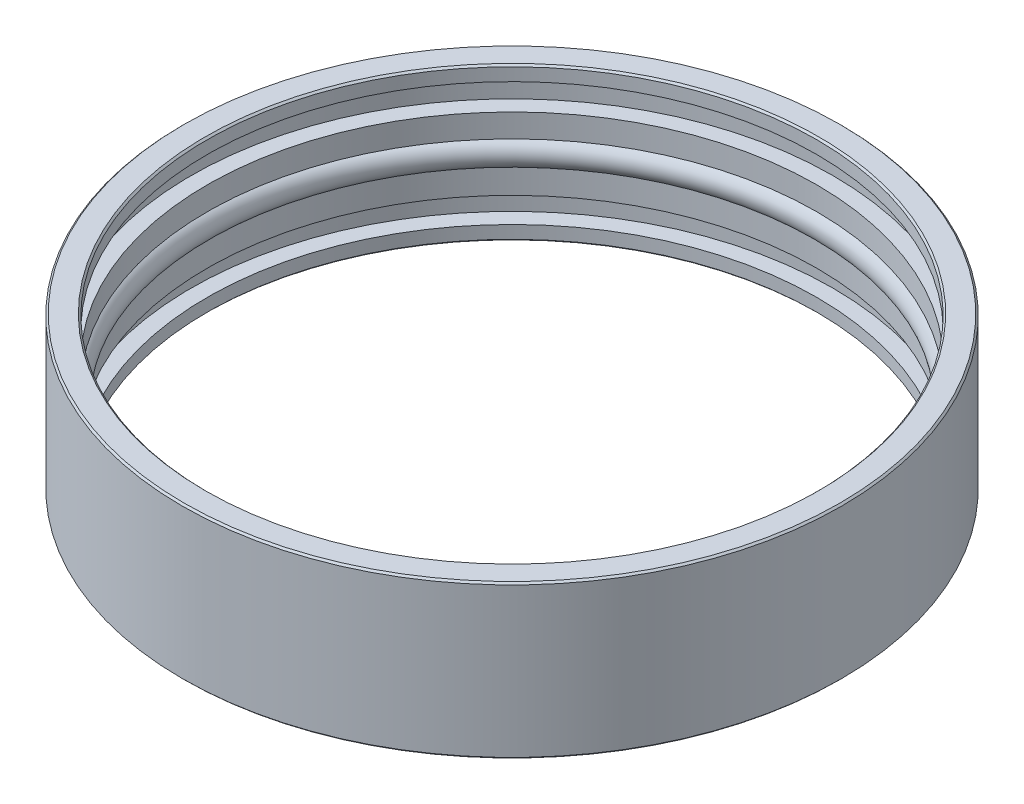
ISO-10303-21;
HEADER;
FILE_DESCRIPTION(('STEP AP214'),'2;1');
FILE_NAME('part.step','',(''),(''),'','','');
FILE_SCHEMA(('AUTOMOTIVE_DESIGN { 1 0 10303 214 1 1 1 1 }'));
ENDSEC;
DATA;
#1=APPLICATION_CONTEXT('core data for automotive mechanical design processes');
#2=APPLICATION_PROTOCOL_DEFINITION('international standard','automotive_design',2000,#1);
#3=PRODUCT_CONTEXT('',#1,'mechanical');
#4=PRODUCT('Part','Part','',(#3));
#5=PRODUCT_RELATED_PRODUCT_CATEGORY('part','',(#4));
#6=PRODUCT_DEFINITION_FORMATION('','',#4);
#7=PRODUCT_DEFINITION_CONTEXT('part definition',#1,'design');
#8=PRODUCT_DEFINITION('design','',#6,#7);
#9=PRODUCT_DEFINITION_SHAPE('','',#8);
#10=(LENGTH_UNIT() NAMED_UNIT(*) SI_UNIT(.MILLI.,.METRE.));
#11=(NAMED_UNIT(*) PLANE_ANGLE_UNIT() SI_UNIT($,.RADIAN.));
#12=(NAMED_UNIT(*) SI_UNIT($,.STERADIAN.) SOLID_ANGLE_UNIT());
#13=UNCERTAINTY_MEASURE_WITH_UNIT(LENGTH_MEASURE(1.E-05),#10,'distance_accuracy_value','');
#14=(GEOMETRIC_REPRESENTATION_CONTEXT(3) GLOBAL_UNCERTAINTY_ASSIGNED_CONTEXT((#13)) GLOBAL_UNIT_ASSIGNED_CONTEXT((#10,
#11,#12)) REPRESENTATION_CONTEXT('',''));
#15=CARTESIAN_POINT('',(0.,0.,0.));
#16=DIRECTION('',(0.,0.,1.));
#17=DIRECTION('',(1.,0.,0.));
#18=AXIS2_PLACEMENT_3D('',#15,#16,#17);
#19=CARTESIAN_POINT('',(0.,-46.1843158015476,0.));
#20=DIRECTION('',(0.,-1.,0.));
#21=DIRECTION('',(0.,0.,-1.));
#22=AXIS2_PLACEMENT_3D('',#19,#20,#21);
#23=CYLINDRICAL_SURFACE('',#22,52.25);
#24=CARTESIAN_POINT('',(0.,6.40345988806243,0.));
#25=DIRECTION('',(0.,1.,0.));
#26=DIRECTION('',(0.,0.,1.));
#27=AXIS2_PLACEMENT_3D('',#24,#25,#26);
#28=CIRCLE('',#27,52.25);
#29=CARTESIAN_POINT('',(0.,6.40345988806243,52.25));
#30=VERTEX_POINT('',#29);
#31=EDGE_CURVE('E42',#30,#30,#28,.T.);
#32=ORIENTED_EDGE('',*,*,#31,.T.);
#33=EDGE_LOOP('',(#32));
#34=FACE_BOUND('',#33,.T.);
#35=CARTESIAN_POINT('',(0.,4.20345988806245,0.));
#36=DIRECTION('',(0.,-1.,0.));
#37=DIRECTION('',(0.,0.,-1.));
#38=AXIS2_PLACEMENT_3D('',#35,#36,#37);
#39=CIRCLE('',#38,52.25);
#40=CARTESIAN_POINT('',(0.,4.20345988806245,-52.25));
#41=VERTEX_POINT('',#40);
#42=EDGE_CURVE('E90',#41,#41,#39,.T.);
#43=ORIENTED_EDGE('',*,*,#42,.T.);
#44=EDGE_LOOP('',(#43));
#45=FACE_BOUND('',#44,.T.);
#46=ADVANCED_FACE('F31',(#34,#45),#23,.F.);
#47=CARTESIAN_POINT('',(52.25,6.70345988806245,0.));
#48=DIRECTION('',(0.,1.,0.));
#49=DIRECTION('',(0.,0.,1.));
#50=AXIS2_PLACEMENT_3D('',#47,#48,#49);
#51=PLANE('',#50);
#52=CARTESIAN_POINT('',(0.,6.70345988806245,0.));
#53=DIRECTION('',(0.,1.,0.));
#54=DIRECTION('',(0.,0.,1.));
#55=AXIS2_PLACEMENT_3D('',#52,#53,#54);
#56=CIRCLE('',#55,52.55);
#57=CARTESIAN_POINT('',(0.,6.70345988806245,52.55));
#58=VERTEX_POINT('',#57);
#59=EDGE_CURVE('E46',#58,#58,#56,.F.);
#60=ORIENTED_EDGE('',*,*,#59,.T.);
#61=EDGE_LOOP('',(#60));
#62=FACE_BOUND('',#61,.T.);
#63=CARTESIAN_POINT('',(0.,6.70345988806245,0.));
#64=DIRECTION('',(0.,1.,0.));
#65=DIRECTION('',(0.,0.,1.));
#66=AXIS2_PLACEMENT_3D('',#63,#64,#65);
#67=CIRCLE('',#66,56.2);
#68=CARTESIAN_POINT('',(0.,6.70345988806245,56.2));
#69=VERTEX_POINT('',#68);
#70=EDGE_CURVE('E51',#69,#69,#67,.T.);
#71=ORIENTED_EDGE('',*,*,#70,.T.);
#72=EDGE_LOOP('',(#71));
#73=FACE_BOUND('',#72,.T.);
#74=ADVANCED_FACE('F112',(#62,#73),#51,.T.);
#75=CARTESIAN_POINT('',(0.,-46.1843158015476,0.));
#76=DIRECTION('',(0.,-1.,0.));
#77=DIRECTION('',(0.,0.,-1.));
#78=AXIS2_PLACEMENT_3D('',#75,#76,#77);
#79=CYLINDRICAL_SURFACE('',#78,56.5);
#80=CARTESIAN_POINT('',(0.,-19.1965401119375,0.));
#81=DIRECTION('',(0.,-1.,0.));
#82=DIRECTION('',(0.,0.,-1.));
#83=AXIS2_PLACEMENT_3D('',#80,#81,#82);
#84=CIRCLE('',#83,56.5);
#85=CARTESIAN_POINT('',(0.,-19.1965401119375,-56.5));
#86=VERTEX_POINT('',#85);
#87=EDGE_CURVE('E10',#86,#86,#84,.F.);
#88=ORIENTED_EDGE('',*,*,#87,.T.);
#89=EDGE_LOOP('',(#88));
#90=FACE_BOUND('',#89,.T.);
#91=CARTESIAN_POINT('',(0.,6.40345988806249,0.));
#92=DIRECTION('',(0.,1.,0.));
#93=DIRECTION('',(0.,0.,1.));
#94=AXIS2_PLACEMENT_3D('',#91,#92,#93);
#95=CIRCLE('',#94,56.5);
#96=CARTESIAN_POINT('',(0.,6.40345988806249,56.5));
#97=VERTEX_POINT('',#96);
#98=EDGE_CURVE('E38',#97,#97,#95,.F.);
#99=ORIENTED_EDGE('',*,*,#98,.T.);
#100=EDGE_LOOP('',(#99));
#101=FACE_BOUND('',#100,.T.);
#102=ADVANCED_FACE('F118',(#90,#101),#79,.T.);
#103=CARTESIAN_POINT('',(56.5,-19.4965401119375,0.));
#104=DIRECTION('',(0.,-1.,0.));
#105=DIRECTION('',(0.,0.,-1.));
#106=AXIS2_PLACEMENT_3D('',#103,#104,#105);
#107=PLANE('',#106);
#108=CARTESIAN_POINT('',(0.,-19.4965401119375,0.));
#109=DIRECTION('',(0.,-1.,0.));
#110=DIRECTION('',(0.,0.,-1.));
#111=AXIS2_PLACEMENT_3D('',#108,#109,#110);
#112=CIRCLE('',#111,52.55);
#113=CARTESIAN_POINT('',(0.,-19.4965401119375,-52.55));
#114=VERTEX_POINT('',#113);
#115=EDGE_CURVE('E54',#114,#114,#112,.F.);
#116=ORIENTED_EDGE('',*,*,#115,.T.);
#117=EDGE_LOOP('',(#116));
#118=FACE_BOUND('',#117,.T.);
#119=CARTESIAN_POINT('',(0.,-19.4965401119375,0.));
#120=DIRECTION('',(0.,-1.,0.));
#121=DIRECTION('',(0.,0.,-1.));
#122=AXIS2_PLACEMENT_3D('',#119,#120,#121);
#123=CIRCLE('',#122,56.2);
#124=CARTESIAN_POINT('',(0.,-19.4965401119375,-56.2));
#125=VERTEX_POINT('',#124);
#126=EDGE_CURVE('E57',#125,#125,#123,.T.);
#127=ORIENTED_EDGE('',*,*,#126,.T.);
#128=EDGE_LOOP('',(#127));
#129=FACE_BOUND('',#128,.T.);
#130=ADVANCED_FACE('F135',(#118,#129),#107,.T.);
#131=CARTESIAN_POINT('',(0.,-46.1843158015476,0.));
#132=DIRECTION('',(0.,-1.,0.));
#133=DIRECTION('',(0.,0.,-1.));
#134=AXIS2_PLACEMENT_3D('',#131,#132,#133);
#135=CYLINDRICAL_SURFACE('',#134,52.25);
#136=CARTESIAN_POINT('',(0.,-19.1965401119376,0.));
#137=DIRECTION('',(0.,-1.,0.));
#138=DIRECTION('',(0.,0.,-1.));
#139=AXIS2_PLACEMENT_3D('',#136,#137,#138);
#140=CIRCLE('',#139,52.25);
#141=CARTESIAN_POINT('',(0.,-19.1965401119376,-52.25));
#142=VERTEX_POINT('',#141);
#143=EDGE_CURVE('E60',#142,#142,#140,.T.);
#144=ORIENTED_EDGE('',*,*,#143,.T.);
#145=EDGE_LOOP('',(#144));
#146=FACE_BOUND('',#145,.T.);
#147=CARTESIAN_POINT('',(0.,-16.9965401119375,0.));
#148=DIRECTION('',(0.,-1.,0.));
#149=DIRECTION('',(0.,0.,-1.));
#150=AXIS2_PLACEMENT_3D('',#147,#148,#149);
#151=CIRCLE('',#150,52.25);
#152=CARTESIAN_POINT('',(0.,-16.9965401119375,-52.25));
#153=VERTEX_POINT('',#152);
#154=EDGE_CURVE('E63',#153,#153,#151,.T.);
#155=ORIENTED_EDGE('',*,*,#154,.F.);
#156=EDGE_LOOP('',(#155));
#157=FACE_BOUND('',#156,.T.);
#158=ADVANCED_FACE('F137',(#146,#157),#135,.F.);
#159=CARTESIAN_POINT('',(52.25,-16.9965401119375,0.));
#160=DIRECTION('',(0.,1.,0.));
#161=DIRECTION('',(0.,0.,1.));
#162=AXIS2_PLACEMENT_3D('',#159,#160,#161);
#163=PLANE('',#162);
#164=ORIENTED_EDGE('',*,*,#154,.T.);
#165=EDGE_LOOP('',(#164));
#166=FACE_BOUND('',#165,.T.);
#167=CARTESIAN_POINT('',(0.,-16.9965401119375,0.));
#168=DIRECTION('',(0.,-1.,0.));
#169=DIRECTION('',(0.,0.,-1.));
#170=AXIS2_PLACEMENT_3D('',#167,#168,#169);
#171=CIRCLE('',#170,55.);
#172=CARTESIAN_POINT('',(0.,-16.9965401119375,-55.));
#173=VERTEX_POINT('',#172);
#174=EDGE_CURVE('E66',#173,#173,#171,.T.);
#175=ORIENTED_EDGE('',*,*,#174,.F.);
#176=EDGE_LOOP('',(#175));
#177=FACE_BOUND('',#176,.T.);
#178=ADVANCED_FACE('F144',(#166,#177),#163,.T.);
#179=CARTESIAN_POINT('',(0.,-46.1843158015476,0.));
#180=DIRECTION('',(0.,-1.,0.));
#181=DIRECTION('',(0.,0.,-1.));
#182=AXIS2_PLACEMENT_3D('',#179,#180,#181);
#183=CYLINDRICAL_SURFACE('',#182,55.);
#184=ORIENTED_EDGE('',*,*,#174,.T.);
#185=EDGE_LOOP('',(#184));
#186=FACE_BOUND('',#185,.T.);
#187=CARTESIAN_POINT('',(0.,-12.6707330822419,0.));
#188=DIRECTION('',(0.,-1.,0.));
#189=DIRECTION('',(0.,0.,-1.));
#190=AXIS2_PLACEMENT_3D('',#187,#188,#189);
#191=CIRCLE('',#190,55.);
#192=CARTESIAN_POINT('',(0.,-12.6707330822419,-55.));
#193=VERTEX_POINT('',#192);
#194=EDGE_CURVE('E69',#193,#193,#191,.T.);
#195=ORIENTED_EDGE('',*,*,#194,.F.);
#196=EDGE_LOOP('',(#195));
#197=FACE_BOUND('',#196,.T.);
#198=ADVANCED_FACE('F150',(#186,#197),#183,.F.);
#199=CARTESIAN_POINT('',(55.,-12.6707330822419,0.));
#200=DIRECTION('',(0.,-1.,0.));
#201=DIRECTION('',(0.,0.,-1.));
#202=AXIS2_PLACEMENT_3D('',#199,#200,#201);
#203=PLANE('',#202);
#204=ORIENTED_EDGE('',*,*,#194,.T.);
#205=EDGE_LOOP('',(#204));
#206=FACE_BOUND('',#205,.T.);
#207=CARTESIAN_POINT('',(0.,-12.6707330822419,0.));
#208=DIRECTION('',(0.,-1.,0.));
#209=DIRECTION('',(0.,0.,-1.));
#210=AXIS2_PLACEMENT_3D('',#207,#208,#209);
#211=CIRCLE('',#210,52.25);
#212=CARTESIAN_POINT('',(0.,-12.6707330822419,-52.25));
#213=VERTEX_POINT('',#212);
#214=EDGE_CURVE('E72',#213,#213,#211,.T.);
#215=ORIENTED_EDGE('',*,*,#214,.F.);
#216=EDGE_LOOP('',(#215));
#217=FACE_BOUND('',#216,.T.);
#218=ADVANCED_FACE('F154',(#206,#217),#203,.T.);
#219=CARTESIAN_POINT('',(0.,-46.1843158015476,0.));
#220=DIRECTION('',(0.,-1.,0.));
#221=DIRECTION('',(0.,0.,-1.));
#222=AXIS2_PLACEMENT_3D('',#219,#220,#221);
#223=CYLINDRICAL_SURFACE('',#222,52.25);
#224=ORIENTED_EDGE('',*,*,#214,.T.);
#225=EDGE_LOOP('',(#224));
#226=FACE_BOUND('',#225,.T.);
#227=CARTESIAN_POINT('',(0.,-8.49654011193755,0.));
#228=DIRECTION('',(0.,-1.,0.));
#229=DIRECTION('',(0.,0.,-1.));
#230=AXIS2_PLACEMENT_3D('',#227,#228,#229);
#231=CIRCLE('',#230,52.25);
#232=CARTESIAN_POINT('',(0.,-8.49654011193755,-52.25));
#233=VERTEX_POINT('',#232);
#234=EDGE_CURVE('E75',#233,#233,#231,.T.);
#235=ORIENTED_EDGE('',*,*,#234,.F.);
#236=EDGE_LOOP('',(#235));
#237=FACE_BOUND('',#236,.T.);
#238=ADVANCED_FACE('F158',(#226,#237),#223,.F.);
#239=CARTESIAN_POINT('',(0.,-6.39654011193755,0.));
#240=DIRECTION('',(0.,-1.,0.));
#241=DIRECTION('',(0.,0.,-1.));
#242=AXIS2_PLACEMENT_3D('',#239,#240,#241);
#243=TOROIDAL_SURFACE('',#242,53.606465996625,2.5);
#244=ORIENTED_EDGE('',*,*,#234,.T.);
#245=EDGE_LOOP('',(#244));
#246=FACE_BOUND('',#245,.T.);
#247=CARTESIAN_POINT('',(0.,-4.29654011193754,0.));
#248=DIRECTION('',(0.,-1.,0.));
#249=DIRECTION('',(0.,0.,-1.));
#250=AXIS2_PLACEMENT_3D('',#247,#248,#249);
#251=CIRCLE('',#250,52.25);
#252=CARTESIAN_POINT('',(0.,-4.29654011193754,-52.25));
#253=VERTEX_POINT('',#252);
#254=EDGE_CURVE('E78',#253,#253,#251,.T.);
#255=ORIENTED_EDGE('',*,*,#254,.F.);
#256=EDGE_LOOP('',(#255));
#257=FACE_BOUND('',#256,.T.);
#258=ADVANCED_FACE('F162',(#246,#257),#243,.T.);
#259=CARTESIAN_POINT('',(0.,-46.1843158015476,0.));
#260=DIRECTION('',(0.,-1.,0.));
#261=DIRECTION('',(0.,0.,-1.));
#262=AXIS2_PLACEMENT_3D('',#259,#260,#261);
#263=CYLINDRICAL_SURFACE('',#262,52.25);
#264=ORIENTED_EDGE('',*,*,#254,.T.);
#265=EDGE_LOOP('',(#264));
#266=FACE_BOUND('',#265,.T.);
#267=CARTESIAN_POINT('',(0.,-0.296540111937547,0.));
#268=DIRECTION('',(0.,-1.,0.));
#269=DIRECTION('',(0.,0.,-1.));
#270=AXIS2_PLACEMENT_3D('',#267,#268,#269);
#271=CIRCLE('',#270,52.25);
#272=CARTESIAN_POINT('',(0.,-0.296540111937547,-52.25));
#273=VERTEX_POINT('',#272);
#274=EDGE_CURVE('E81',#273,#273,#271,.T.);
#275=ORIENTED_EDGE('',*,*,#274,.F.);
#276=EDGE_LOOP('',(#275));
#277=FACE_BOUND('',#276,.T.);
#278=ADVANCED_FACE('F166',(#266,#277),#263,.F.);
#279=CARTESIAN_POINT('',(55.,-0.296540111937548,0.));
#280=DIRECTION('',(0.,1.,0.));
#281=DIRECTION('',(0.,0.,1.));
#282=AXIS2_PLACEMENT_3D('',#279,#280,#281);
#283=PLANE('',#282);
#284=ORIENTED_EDGE('',*,*,#274,.T.);
#285=EDGE_LOOP('',(#284));
#286=FACE_BOUND('',#285,.T.);
#287=CARTESIAN_POINT('',(0.,-0.296540111937547,0.));
#288=DIRECTION('',(0.,-1.,0.));
#289=DIRECTION('',(0.,0.,-1.));
#290=AXIS2_PLACEMENT_3D('',#287,#288,#289);
#291=CIRCLE('',#290,55.);
#292=CARTESIAN_POINT('',(0.,-0.296540111937547,-55.));
#293=VERTEX_POINT('',#292);
#294=EDGE_CURVE('E84',#293,#293,#291,.T.);
#295=ORIENTED_EDGE('',*,*,#294,.F.);
#296=EDGE_LOOP('',(#295));
#297=FACE_BOUND('',#296,.T.);
#298=ADVANCED_FACE('F108',(#286,#297),#283,.T.);
#299=CARTESIAN_POINT('',(0.,-46.1843158015476,0.));
#300=DIRECTION('',(0.,-1.,0.));
#301=DIRECTION('',(0.,0.,-1.));
#302=AXIS2_PLACEMENT_3D('',#299,#300,#301);
#303=CYLINDRICAL_SURFACE('',#302,55.);
#304=ORIENTED_EDGE('',*,*,#294,.T.);
#305=EDGE_LOOP('',(#304));
#306=FACE_BOUND('',#305,.T.);
#307=CARTESIAN_POINT('',(0.,4.20345988806245,0.));
#308=DIRECTION('',(0.,-1.,0.));
#309=DIRECTION('',(0.,0.,-1.));
#310=AXIS2_PLACEMENT_3D('',#307,#308,#309);
#311=CIRCLE('',#310,55.);
#312=CARTESIAN_POINT('',(0.,4.20345988806245,-55.));
#313=VERTEX_POINT('',#312);
#314=EDGE_CURVE('E87',#313,#313,#311,.T.);
#315=ORIENTED_EDGE('',*,*,#314,.F.);
#316=EDGE_LOOP('',(#315));
#317=FACE_BOUND('',#316,.T.);
#318=ADVANCED_FACE('F98',(#306,#317),#303,.F.);
#319=CARTESIAN_POINT('',(52.25,4.20345988806245,0.));
#320=DIRECTION('',(0.,-1.,0.));
#321=DIRECTION('',(0.,0.,-1.));
#322=AXIS2_PLACEMENT_3D('',#319,#320,#321);
#323=PLANE('',#322);
#324=ORIENTED_EDGE('',*,*,#314,.T.);
#325=EDGE_LOOP('',(#324));
#326=FACE_BOUND('',#325,.T.);
#327=ORIENTED_EDGE('',*,*,#42,.F.);
#328=EDGE_LOOP('',(#327));
#329=FACE_BOUND('',#328,.T.);
#330=ADVANCED_FACE('F95',(#326,#329),#323,.T.);
#331=CARTESIAN_POINT('',(0.,-19.1965401119376,0.));
#332=DIRECTION('',(0.,-1.,0.));
#333=DIRECTION('',(0.,0.,-1.));
#334=AXIS2_PLACEMENT_3D('',#331,#332,#333);
#335=CONICAL_SURFACE('',#334,52.25,0.785398163397425);
#336=ORIENTED_EDGE('',*,*,#115,.F.);
#337=EDGE_LOOP('',(#336));
#338=FACE_BOUND('',#337,.T.);
#339=ORIENTED_EDGE('',*,*,#143,.F.);
#340=EDGE_LOOP('',(#339));
#341=FACE_BOUND('',#340,.T.);
#342=ADVANCED_FACE('F97',(#338,#341),#335,.F.);
#343=CARTESIAN_POINT('',(0.,6.70345988806245,0.));
#344=DIRECTION('',(0.,1.,0.));
#345=DIRECTION('',(0.,0.,1.));
#346=AXIS2_PLACEMENT_3D('',#343,#344,#345);
#347=CONICAL_SURFACE('',#346,52.55,0.78539816339746);
#348=ORIENTED_EDGE('',*,*,#31,.F.);
#349=EDGE_LOOP('',(#348));
#350=FACE_BOUND('',#349,.T.);
#351=ORIENTED_EDGE('',*,*,#59,.F.);
#352=EDGE_LOOP('',(#351));
#353=FACE_BOUND('',#352,.T.);
#354=ADVANCED_FACE('F105',(#350,#353),#347,.F.);
#355=CARTESIAN_POINT('',(0.,-19.4965401119375,0.));
#356=DIRECTION('',(0.,1.,0.));
#357=DIRECTION('',(0.,0.,1.));
#358=AXIS2_PLACEMENT_3D('',#355,#356,#357);
#359=CONICAL_SURFACE('',#358,56.2,0.785398163397471);
#360=ORIENTED_EDGE('',*,*,#87,.F.);
#361=EDGE_LOOP('',(#360));
#362=FACE_BOUND('',#361,.T.);
#363=ORIENTED_EDGE('',*,*,#126,.F.);
#364=EDGE_LOOP('',(#363));
#365=FACE_BOUND('',#364,.T.);
#366=ADVANCED_FACE('F124',(#362,#365),#359,.T.);
#367=CARTESIAN_POINT('',(0.,6.40345988806249,0.));
#368=DIRECTION('',(0.,-1.,0.));
#369=DIRECTION('',(0.,0.,-1.));
#370=AXIS2_PLACEMENT_3D('',#367,#368,#369);
#371=CONICAL_SURFACE('',#370,56.5,0.78539816339746);
#372=ORIENTED_EDGE('',*,*,#70,.F.);
#373=EDGE_LOOP('',(#372));
#374=FACE_BOUND('',#373,.T.);
#375=ORIENTED_EDGE('',*,*,#98,.F.);
#376=EDGE_LOOP('',(#375));
#377=FACE_BOUND('',#376,.T.);
#378=ADVANCED_FACE('F33',(#374,#377),#371,.T.);
#379=CLOSED_SHELL('',(#46,#74,#102,#130,#158,#178,#198,#218,#238,#258,#278,#298,#318,#330,#342,
#354,#366,#378));
#380=MANIFOLD_SOLID_BREP('B2',#379);
#381=ADVANCED_BREP_SHAPE_REPRESENTATION('',(#18,#380),#14);
#382=SHAPE_DEFINITION_REPRESENTATION(#9,#381);
ENDSEC;
END-ISO-10303-21;
